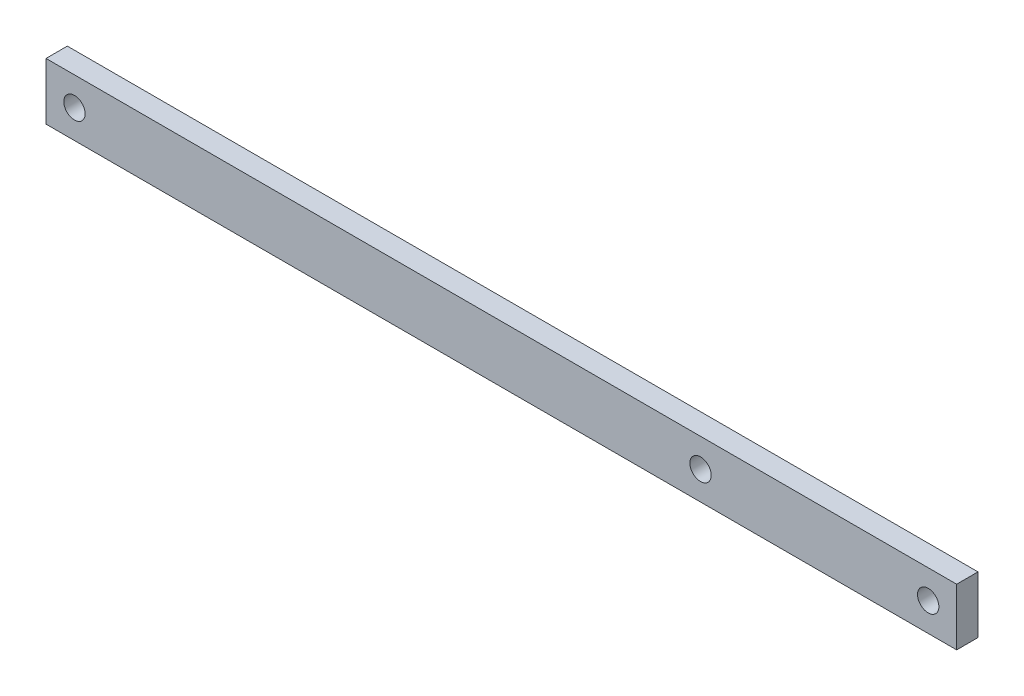
ISO-10303-21;
HEADER;
FILE_DESCRIPTION(('STEP AP214'),'2;1');
FILE_NAME('part.step','',(''),(''),'','','');
FILE_SCHEMA(('AUTOMOTIVE_DESIGN { 1 0 10303 214 1 1 1 1 }'));
ENDSEC;
DATA;
#1=APPLICATION_CONTEXT('core data for automotive mechanical design processes');
#2=APPLICATION_PROTOCOL_DEFINITION('international standard','automotive_design',2000,#1);
#3=PRODUCT_CONTEXT('',#1,'mechanical');
#4=PRODUCT('Part','Part','',(#3));
#5=PRODUCT_RELATED_PRODUCT_CATEGORY('part','',(#4));
#6=PRODUCT_DEFINITION_FORMATION('','',#4);
#7=PRODUCT_DEFINITION_CONTEXT('part definition',#1,'design');
#8=PRODUCT_DEFINITION('design','',#6,#7);
#9=PRODUCT_DEFINITION_SHAPE('','',#8);
#10=(LENGTH_UNIT() NAMED_UNIT(*) SI_UNIT(.MILLI.,.METRE.));
#11=(NAMED_UNIT(*) PLANE_ANGLE_UNIT() SI_UNIT($,.RADIAN.));
#12=(NAMED_UNIT(*) SI_UNIT($,.STERADIAN.) SOLID_ANGLE_UNIT());
#13=UNCERTAINTY_MEASURE_WITH_UNIT(LENGTH_MEASURE(1.E-05),#10,'distance_accuracy_value','');
#14=(GEOMETRIC_REPRESENTATION_CONTEXT(3) GLOBAL_UNCERTAINTY_ASSIGNED_CONTEXT((#13)) GLOBAL_UNIT_ASSIGNED_CONTEXT((#10,
#11,#12)) REPRESENTATION_CONTEXT('',''));
#15=CARTESIAN_POINT('',(0.,0.,0.));
#16=DIRECTION('',(0.,0.,1.));
#17=DIRECTION('',(1.,0.,0.));
#18=AXIS2_PLACEMENT_3D('',#15,#16,#17);
#19=CARTESIAN_POINT('',(0.,0.,4.7625));
#20=DIRECTION('',(0.,0.,1.));
#21=DIRECTION('',(1.,0.,0.));
#22=AXIS2_PLACEMENT_3D('',#19,#20,#21);
#23=PLANE('',#22);
#24=CARTESIAN_POINT('',(44.45,0.,4.7625));
#25=DIRECTION('',(0.,0.,1.));
#26=DIRECTION('',(1.,0.,0.));
#27=AXIS2_PLACEMENT_3D('',#24,#25,#26);
#28=CIRCLE('',#27,2.38125);
#29=CARTESIAN_POINT('',(42.06875,0.,4.7625));
#30=VERTEX_POINT('',#29);
#31=EDGE_CURVE('E115',#30,#30,#28,.T.);
#32=ORIENTED_EDGE('',*,*,#31,.F.);
#33=EDGE_LOOP('',(#32));
#34=FACE_BOUND('',#33,.T.);
#35=DIRECTION('',(0.,-1.,0.));
#36=VECTOR('',#35,1.);
#37=CARTESIAN_POINT('',(-101.6,-6.35000000000001,4.7625));
#38=LINE('',#37,#36);
#39=CARTESIAN_POINT('',(-101.6,6.34999999999999,4.7625));
#40=VERTEX_POINT('',#39);
#41=CARTESIAN_POINT('',(-101.6,-6.35000000000001,4.7625));
#42=VERTEX_POINT('',#41);
#43=EDGE_CURVE('E85',#40,#42,#38,.T.);
#44=ORIENTED_EDGE('',*,*,#43,.T.);
#45=DIRECTION('',(1.,0.,0.));
#46=VECTOR('',#45,1.);
#47=CARTESIAN_POINT('',(101.6,-6.34999999999999,4.7625));
#48=LINE('',#47,#46);
#49=CARTESIAN_POINT('',(101.6,-6.34999999999999,4.7625));
#50=VERTEX_POINT('',#49);
#51=EDGE_CURVE('E80',#42,#50,#48,.T.);
#52=ORIENTED_EDGE('',*,*,#51,.T.);
#53=DIRECTION('',(0.,1.,0.));
#54=VECTOR('',#53,1.);
#55=CARTESIAN_POINT('',(101.6,-6.34999999999999,4.7625));
#56=LINE('',#55,#54);
#57=CARTESIAN_POINT('',(101.6,6.35000000000001,4.7625));
#58=VERTEX_POINT('',#57);
#59=EDGE_CURVE('E83',#50,#58,#56,.T.);
#60=ORIENTED_EDGE('',*,*,#59,.T.);
#61=DIRECTION('',(-1.,0.,0.));
#62=VECTOR('',#61,1.);
#63=CARTESIAN_POINT('',(101.6,6.35000000000001,4.7625));
#64=LINE('',#63,#62);
#65=EDGE_CURVE('E50',#58,#40,#64,.T.);
#66=ORIENTED_EDGE('',*,*,#65,.T.);
#67=EDGE_LOOP('',(#44,#52,#60,#66));
#68=FACE_BOUND('',#67,.T.);
#69=CARTESIAN_POINT('',(95.25,0.,4.7625));
#70=DIRECTION('',(0.,0.,1.));
#71=DIRECTION('',(1.,0.,0.));
#72=AXIS2_PLACEMENT_3D('',#69,#70,#71);
#73=CIRCLE('',#72,2.38125000000001);
#74=CARTESIAN_POINT('',(92.86875,0.,4.7625));
#75=VERTEX_POINT('',#74);
#76=EDGE_CURVE('E100',#75,#75,#73,.T.);
#77=ORIENTED_EDGE('',*,*,#76,.F.);
#78=EDGE_LOOP('',(#77));
#79=FACE_BOUND('',#78,.T.);
#80=CARTESIAN_POINT('',(-95.25,0.,4.7625));
#81=DIRECTION('',(0.,0.,1.));
#82=DIRECTION('',(1.,0.,0.));
#83=AXIS2_PLACEMENT_3D('',#80,#81,#82);
#84=CIRCLE('',#83,2.38125000000001);
#85=CARTESIAN_POINT('',(-97.63125,0.,4.7625));
#86=VERTEX_POINT('',#85);
#87=EDGE_CURVE('E121',#86,#86,#84,.T.);
#88=ORIENTED_EDGE('',*,*,#87,.F.);
#89=EDGE_LOOP('',(#88));
#90=FACE_BOUND('',#89,.T.);
#91=ADVANCED_FACE('F33',(#34,#68,#79,#90),#23,.T.);
#92=CARTESIAN_POINT('',(0.,0.,0.));
#93=DIRECTION('',(0.,0.,1.));
#94=DIRECTION('',(1.,0.,0.));
#95=AXIS2_PLACEMENT_3D('',#92,#93,#94);
#96=PLANE('',#95);
#97=DIRECTION('',(0.,-1.,0.));
#98=VECTOR('',#97,1.);
#99=CARTESIAN_POINT('',(-101.6,-6.35000000000001,0.));
#100=LINE('',#99,#98);
#101=CARTESIAN_POINT('',(-101.6,6.34999999999999,0.));
#102=VERTEX_POINT('',#101);
#103=CARTESIAN_POINT('',(-101.6,-6.35000000000001,0.));
#104=VERTEX_POINT('',#103);
#105=EDGE_CURVE('E97',#102,#104,#100,.T.);
#106=ORIENTED_EDGE('',*,*,#105,.F.);
#107=DIRECTION('',(-1.,0.,0.));
#108=VECTOR('',#107,1.);
#109=CARTESIAN_POINT('',(101.6,6.35000000000001,0.));
#110=LINE('',#109,#108);
#111=CARTESIAN_POINT('',(101.6,6.35000000000001,0.));
#112=VERTEX_POINT('',#111);
#113=EDGE_CURVE('E73',#112,#102,#110,.T.);
#114=ORIENTED_EDGE('',*,*,#113,.F.);
#115=DIRECTION('',(0.,1.,0.));
#116=VECTOR('',#115,1.);
#117=CARTESIAN_POINT('',(101.6,-6.34999999999999,0.));
#118=LINE('',#117,#116);
#119=CARTESIAN_POINT('',(101.6,-6.34999999999999,0.));
#120=VERTEX_POINT('',#119);
#121=EDGE_CURVE('E67',#120,#112,#118,.T.);
#122=ORIENTED_EDGE('',*,*,#121,.F.);
#123=DIRECTION('',(1.,0.,0.));
#124=VECTOR('',#123,1.);
#125=CARTESIAN_POINT('',(101.6,-6.34999999999999,0.));
#126=LINE('',#125,#124);
#127=EDGE_CURVE('E89',#104,#120,#126,.T.);
#128=ORIENTED_EDGE('',*,*,#127,.F.);
#129=EDGE_LOOP('',(#106,#114,#122,#128));
#130=FACE_BOUND('',#129,.T.);
#131=CARTESIAN_POINT('',(95.25,0.,0.));
#132=DIRECTION('',(0.,0.,1.));
#133=DIRECTION('',(1.,0.,0.));
#134=AXIS2_PLACEMENT_3D('',#131,#132,#133);
#135=CIRCLE('',#134,2.38125000000001);
#136=CARTESIAN_POINT('',(92.86875,0.,0.));
#137=VERTEX_POINT('',#136);
#138=EDGE_CURVE('E112',#137,#137,#135,.T.);
#139=ORIENTED_EDGE('',*,*,#138,.T.);
#140=EDGE_LOOP('',(#139));
#141=FACE_BOUND('',#140,.T.);
#142=CARTESIAN_POINT('',(44.45,0.,0.));
#143=DIRECTION('',(0.,0.,1.));
#144=DIRECTION('',(1.,0.,0.));
#145=AXIS2_PLACEMENT_3D('',#142,#143,#144);
#146=CIRCLE('',#145,2.38125);
#147=CARTESIAN_POINT('',(42.06875,0.,0.));
#148=VERTEX_POINT('',#147);
#149=EDGE_CURVE('E118',#148,#148,#146,.T.);
#150=ORIENTED_EDGE('',*,*,#149,.T.);
#151=EDGE_LOOP('',(#150));
#152=FACE_BOUND('',#151,.T.);
#153=CARTESIAN_POINT('',(-95.25,0.,0.));
#154=DIRECTION('',(0.,0.,1.));
#155=DIRECTION('',(1.,0.,0.));
#156=AXIS2_PLACEMENT_3D('',#153,#154,#155);
#157=CIRCLE('',#156,2.38125000000001);
#158=CARTESIAN_POINT('',(-97.63125,0.,0.));
#159=VERTEX_POINT('',#158);
#160=EDGE_CURVE('E124',#159,#159,#157,.T.);
#161=ORIENTED_EDGE('',*,*,#160,.T.);
#162=EDGE_LOOP('',(#161));
#163=FACE_BOUND('',#162,.T.);
#164=ADVANCED_FACE('F108',(#130,#141,#152,#163),#96,.F.);
#165=CARTESIAN_POINT('',(-101.6,-6.35000000000001,4.7625));
#166=DIRECTION('',(1.,0.,0.));
#167=DIRECTION('',(0.,0.,-1.));
#168=AXIS2_PLACEMENT_3D('',#165,#166,#167);
#169=PLANE('',#168);
#170=ORIENTED_EDGE('',*,*,#105,.T.);
#171=DIRECTION('',(0.,0.,-1.));
#172=VECTOR('',#171,1.);
#173=CARTESIAN_POINT('',(-101.6,-6.35000000000001,4.7625));
#174=LINE('',#173,#172);
#175=EDGE_CURVE('E11',#42,#104,#174,.T.);
#176=ORIENTED_EDGE('',*,*,#175,.F.);
#177=ORIENTED_EDGE('',*,*,#43,.F.);
#178=DIRECTION('',(0.,0.,-1.));
#179=VECTOR('',#178,1.);
#180=CARTESIAN_POINT('',(-101.6,6.34999999999999,4.7625));
#181=LINE('',#180,#179);
#182=EDGE_CURVE('E93',#40,#102,#181,.T.);
#183=ORIENTED_EDGE('',*,*,#182,.T.);
#184=EDGE_LOOP('',(#170,#176,#177,#183));
#185=FACE_BOUND('',#184,.T.);
#186=ADVANCED_FACE('F35',(#185),#169,.F.);
#187=CARTESIAN_POINT('',(101.6,-6.34999999999999,4.7625));
#188=DIRECTION('',(0.,1.,0.));
#189=DIRECTION('',(-1.,0.,0.));
#190=AXIS2_PLACEMENT_3D('',#187,#188,#189);
#191=PLANE('',#190);
#192=ORIENTED_EDGE('',*,*,#127,.T.);
#193=DIRECTION('',(0.,0.,-1.));
#194=VECTOR('',#193,1.);
#195=CARTESIAN_POINT('',(101.6,-6.34999999999999,4.7625));
#196=LINE('',#195,#194);
#197=EDGE_CURVE('E42',#50,#120,#196,.T.);
#198=ORIENTED_EDGE('',*,*,#197,.F.);
#199=ORIENTED_EDGE('',*,*,#51,.F.);
#200=ORIENTED_EDGE('',*,*,#175,.T.);
#201=EDGE_LOOP('',(#192,#198,#199,#200));
#202=FACE_BOUND('',#201,.T.);
#203=ADVANCED_FACE('F88',(#202),#191,.F.);
#204=CARTESIAN_POINT('',(101.6,-6.34999999999999,4.7625));
#205=DIRECTION('',(-1.,0.,0.));
#206=DIRECTION('',(0.,0.,1.));
#207=AXIS2_PLACEMENT_3D('',#204,#205,#206);
#208=PLANE('',#207);
#209=ORIENTED_EDGE('',*,*,#121,.T.);
#210=DIRECTION('',(0.,0.,-1.));
#211=VECTOR('',#210,1.);
#212=CARTESIAN_POINT('',(101.6,6.35000000000001,4.7625));
#213=LINE('',#212,#211);
#214=EDGE_CURVE('E90',#58,#112,#213,.T.);
#215=ORIENTED_EDGE('',*,*,#214,.F.);
#216=ORIENTED_EDGE('',*,*,#59,.F.);
#217=ORIENTED_EDGE('',*,*,#197,.T.);
#218=EDGE_LOOP('',(#209,#215,#216,#217));
#219=FACE_BOUND('',#218,.T.);
#220=ADVANCED_FACE('F91',(#219),#208,.F.);
#221=CARTESIAN_POINT('',(101.6,6.35000000000001,4.7625));
#222=DIRECTION('',(0.,-1.,0.));
#223=DIRECTION('',(1.,0.,0.));
#224=AXIS2_PLACEMENT_3D('',#221,#222,#223);
#225=PLANE('',#224);
#226=ORIENTED_EDGE('',*,*,#113,.T.);
#227=ORIENTED_EDGE('',*,*,#182,.F.);
#228=ORIENTED_EDGE('',*,*,#65,.F.);
#229=ORIENTED_EDGE('',*,*,#214,.T.);
#230=EDGE_LOOP('',(#226,#227,#228,#229));
#231=FACE_BOUND('',#230,.T.);
#232=ADVANCED_FACE('F105',(#231),#225,.F.);
#233=CARTESIAN_POINT('',(95.25,0.,4.7625));
#234=DIRECTION('',(0.,0.,-1.));
#235=DIRECTION('',(-1.,0.,0.));
#236=AXIS2_PLACEMENT_3D('',#233,#234,#235);
#237=CYLINDRICAL_SURFACE('',#236,2.38125000000001);
#238=CARTESIAN_POINT('',(92.86875,0.,4.7625));
#239=CARTESIAN_POINT('',(92.86875,0.,4.712890625));
#240=CARTESIAN_POINT('',(92.86875,0.,4.66328125));
#241=CARTESIAN_POINT('',(92.86875,0.,4.5640625));
#242=CARTESIAN_POINT('',(92.86875,0.,4.514453125));
#243=CARTESIAN_POINT('',(92.86875,0.,4.415234375));
#244=CARTESIAN_POINT('',(92.86875,0.,4.365625));
#245=CARTESIAN_POINT('',(92.86875,0.,4.26640625));
#246=CARTESIAN_POINT('',(92.86875,0.,4.216796875));
#247=CARTESIAN_POINT('',(92.86875,0.,4.117578125));
#248=CARTESIAN_POINT('',(92.86875,0.,4.06796875));
#249=CARTESIAN_POINT('',(92.86875,0.,3.96875));
#250=CARTESIAN_POINT('',(92.86875,0.,3.919140625));
#251=CARTESIAN_POINT('',(92.86875,0.,3.819921875));
#252=CARTESIAN_POINT('',(92.86875,0.,3.7703125));
#253=CARTESIAN_POINT('',(92.86875,0.,3.67109375));
#254=CARTESIAN_POINT('',(92.86875,0.,3.621484375));
#255=CARTESIAN_POINT('',(92.86875,0.,3.522265625));
#256=CARTESIAN_POINT('',(92.86875,0.,3.47265625));
#257=CARTESIAN_POINT('',(92.86875,0.,3.3734375));
#258=CARTESIAN_POINT('',(92.86875,0.,3.323828125));
#259=CARTESIAN_POINT('',(92.86875,0.,3.224609375));
#260=CARTESIAN_POINT('',(92.86875,0.,3.175));
#261=CARTESIAN_POINT('',(92.86875,0.,3.07578125));
#262=CARTESIAN_POINT('',(92.86875,0.,3.026171875));
#263=CARTESIAN_POINT('',(92.86875,0.,2.926953125));
#264=CARTESIAN_POINT('',(92.86875,0.,2.87734375));
#265=CARTESIAN_POINT('',(92.86875,0.,2.778125));
#266=CARTESIAN_POINT('',(92.86875,0.,2.728515625));
#267=CARTESIAN_POINT('',(92.86875,0.,2.629296875));
#268=CARTESIAN_POINT('',(92.86875,0.,2.5796875));
#269=CARTESIAN_POINT('',(92.86875,0.,2.48046875));
#270=CARTESIAN_POINT('',(92.86875,0.,2.430859375));
#271=CARTESIAN_POINT('',(92.86875,0.,2.331640625));
#272=CARTESIAN_POINT('',(92.86875,0.,2.28203125));
#273=CARTESIAN_POINT('',(92.86875,0.,2.1828125));
#274=CARTESIAN_POINT('',(92.86875,0.,2.133203125));
#275=CARTESIAN_POINT('',(92.86875,0.,2.033984375));
#276=CARTESIAN_POINT('',(92.86875,0.,1.984375));
#277=CARTESIAN_POINT('',(92.86875,0.,1.88515625));
#278=CARTESIAN_POINT('',(92.86875,0.,1.835546875));
#279=CARTESIAN_POINT('',(92.86875,0.,1.736328125));
#280=CARTESIAN_POINT('',(92.86875,0.,1.68671875));
#281=CARTESIAN_POINT('',(92.86875,0.,1.5875));
#282=CARTESIAN_POINT('',(92.86875,0.,1.537890625));
#283=CARTESIAN_POINT('',(92.86875,0.,1.438671875));
#284=CARTESIAN_POINT('',(92.86875,0.,1.3890625));
#285=CARTESIAN_POINT('',(92.86875,0.,1.28984375));
#286=CARTESIAN_POINT('',(92.86875,0.,1.240234375));
#287=CARTESIAN_POINT('',(92.86875,0.,1.141015625));
#288=CARTESIAN_POINT('',(92.86875,0.,1.09140625));
#289=CARTESIAN_POINT('',(92.86875,0.,0.992187499999999));
#290=CARTESIAN_POINT('',(92.86875,0.,0.942578124999999));
#291=CARTESIAN_POINT('',(92.86875,0.,0.843359375));
#292=CARTESIAN_POINT('',(92.86875,0.,0.79375));
#293=CARTESIAN_POINT('',(92.86875,0.,0.69453125));
#294=CARTESIAN_POINT('',(92.86875,0.,0.644921875));
#295=CARTESIAN_POINT('',(92.86875,0.,0.545703125));
#296=CARTESIAN_POINT('',(92.86875,0.,0.49609375));
#297=CARTESIAN_POINT('',(92.86875,0.,0.396875));
#298=CARTESIAN_POINT('',(92.86875,0.,0.347265625));
#299=CARTESIAN_POINT('',(92.86875,0.,0.248046875));
#300=CARTESIAN_POINT('',(92.86875,0.,0.1984375));
#301=CARTESIAN_POINT('',(92.86875,0.,0.09921875));
#302=CARTESIAN_POINT('',(92.86875,0.,0.049609375));
#303=CARTESIAN_POINT('',(92.86875,0.,0.));
#304=B_SPLINE_CURVE_WITH_KNOTS('',3,(#238,#239,#240,#241,#242,#243,#244,#245,#246,#247,#248,
#249,#250,#251,#252,#253,#254,#255,#256,#257,#258,#259,#260,#261,#262,#263,#264,#265,#266,#267,
#268,#269,#270,#271,#272,#273,#274,#275,#276,#277,#278,#279,#280,#281,#282,#283,#284,#285,#286,
#287,#288,#289,#290,#291,#292,#293,#294,#295,#296,#297,#298,#299,#300,#301,#302,#303),
.UNSPECIFIED.,.F.,.F.,(4,2,2,2,2,2,2,2,2,2,2,2,2,2,2,2,2,2,2,2,2,2,2,2,2,2,2,2,2,2,2,2,4),(0.,
0.148828125,0.29765625,0.446484375,0.5953125,0.744140625,0.892968750000001,1.041796875,1.190625,
1.339453125,1.48828125,1.637109375,1.7859375,1.934765625,2.08359375,2.232421875,2.38125,
2.530078125,2.67890625,2.827734375,2.9765625,3.125390625,3.27421875,3.423046875,3.571875,
3.720703125,3.86953125,4.018359375,4.1671875,4.316015625,4.46484375,4.613671875,4.7625),.UNSPECIFIED.);
#305=EDGE_CURVE('BSEAM142',#75,#137,#304,.T.);
#306=ORIENTED_EDGE('',*,*,#76,.T.);
#307=ORIENTED_EDGE('',*,*,#138,.F.);
#308=ORIENTED_EDGE('',*,*,#305,.T.);
#309=ORIENTED_EDGE('',*,*,#305,.F.);
#310=EDGE_LOOP('',(#306,#308,#307,#309));
#311=FACE_BOUND('',#310,.T.);
#312=ADVANCED_FACE('F142',(#311),#237,.F.);
#313=CARTESIAN_POINT('',(44.45,0.,4.7625));
#314=DIRECTION('',(0.,0.,-1.));
#315=DIRECTION('',(-1.,0.,0.));
#316=AXIS2_PLACEMENT_3D('',#313,#314,#315);
#317=CYLINDRICAL_SURFACE('',#316,2.38125);
#318=CARTESIAN_POINT('',(42.06875,0.,4.7625));
#319=CARTESIAN_POINT('',(42.06875,0.,4.712890625));
#320=CARTESIAN_POINT('',(42.06875,0.,4.66328125));
#321=CARTESIAN_POINT('',(42.06875,0.,4.5640625));
#322=CARTESIAN_POINT('',(42.06875,0.,4.514453125));
#323=CARTESIAN_POINT('',(42.06875,0.,4.415234375));
#324=CARTESIAN_POINT('',(42.06875,0.,4.365625));
#325=CARTESIAN_POINT('',(42.06875,0.,4.26640625));
#326=CARTESIAN_POINT('',(42.06875,0.,4.216796875));
#327=CARTESIAN_POINT('',(42.06875,0.,4.117578125));
#328=CARTESIAN_POINT('',(42.06875,0.,4.06796875));
#329=CARTESIAN_POINT('',(42.06875,0.,3.96875));
#330=CARTESIAN_POINT('',(42.06875,0.,3.919140625));
#331=CARTESIAN_POINT('',(42.06875,0.,3.819921875));
#332=CARTESIAN_POINT('',(42.06875,0.,3.7703125));
#333=CARTESIAN_POINT('',(42.06875,0.,3.67109375));
#334=CARTESIAN_POINT('',(42.06875,0.,3.621484375));
#335=CARTESIAN_POINT('',(42.06875,0.,3.522265625));
#336=CARTESIAN_POINT('',(42.06875,0.,3.47265625));
#337=CARTESIAN_POINT('',(42.06875,0.,3.3734375));
#338=CARTESIAN_POINT('',(42.06875,0.,3.323828125));
#339=CARTESIAN_POINT('',(42.06875,0.,3.224609375));
#340=CARTESIAN_POINT('',(42.06875,0.,3.175));
#341=CARTESIAN_POINT('',(42.06875,0.,3.07578125));
#342=CARTESIAN_POINT('',(42.06875,0.,3.026171875));
#343=CARTESIAN_POINT('',(42.06875,0.,2.926953125));
#344=CARTESIAN_POINT('',(42.06875,0.,2.87734375));
#345=CARTESIAN_POINT('',(42.06875,0.,2.778125));
#346=CARTESIAN_POINT('',(42.06875,0.,2.728515625));
#347=CARTESIAN_POINT('',(42.06875,0.,2.629296875));
#348=CARTESIAN_POINT('',(42.06875,0.,2.5796875));
#349=CARTESIAN_POINT('',(42.06875,0.,2.48046875));
#350=CARTESIAN_POINT('',(42.06875,0.,2.430859375));
#351=CARTESIAN_POINT('',(42.06875,0.,2.331640625));
#352=CARTESIAN_POINT('',(42.06875,0.,2.28203125));
#353=CARTESIAN_POINT('',(42.06875,0.,2.1828125));
#354=CARTESIAN_POINT('',(42.06875,0.,2.133203125));
#355=CARTESIAN_POINT('',(42.06875,0.,2.033984375));
#356=CARTESIAN_POINT('',(42.06875,0.,1.984375));
#357=CARTESIAN_POINT('',(42.06875,0.,1.88515625));
#358=CARTESIAN_POINT('',(42.06875,0.,1.835546875));
#359=CARTESIAN_POINT('',(42.06875,0.,1.736328125));
#360=CARTESIAN_POINT('',(42.06875,0.,1.68671875));
#361=CARTESIAN_POINT('',(42.06875,0.,1.5875));
#362=CARTESIAN_POINT('',(42.06875,0.,1.537890625));
#363=CARTESIAN_POINT('',(42.06875,0.,1.438671875));
#364=CARTESIAN_POINT('',(42.06875,0.,1.3890625));
#365=CARTESIAN_POINT('',(42.06875,0.,1.28984375));
#366=CARTESIAN_POINT('',(42.06875,0.,1.240234375));
#367=CARTESIAN_POINT('',(42.06875,0.,1.141015625));
#368=CARTESIAN_POINT('',(42.06875,0.,1.09140625));
#369=CARTESIAN_POINT('',(42.06875,0.,0.992187499999999));
#370=CARTESIAN_POINT('',(42.06875,0.,0.942578124999999));
#371=CARTESIAN_POINT('',(42.06875,0.,0.843359375));
#372=CARTESIAN_POINT('',(42.06875,0.,0.79375));
#373=CARTESIAN_POINT('',(42.06875,0.,0.69453125));
#374=CARTESIAN_POINT('',(42.06875,0.,0.644921875));
#375=CARTESIAN_POINT('',(42.06875,0.,0.545703125));
#376=CARTESIAN_POINT('',(42.06875,0.,0.49609375));
#377=CARTESIAN_POINT('',(42.06875,0.,0.396875));
#378=CARTESIAN_POINT('',(42.06875,0.,0.347265625));
#379=CARTESIAN_POINT('',(42.06875,0.,0.248046875));
#380=CARTESIAN_POINT('',(42.06875,0.,0.1984375));
#381=CARTESIAN_POINT('',(42.06875,0.,0.09921875));
#382=CARTESIAN_POINT('',(42.06875,0.,0.049609375));
#383=CARTESIAN_POINT('',(42.06875,0.,0.));
#384=B_SPLINE_CURVE_WITH_KNOTS('',3,(#318,#319,#320,#321,#322,#323,#324,#325,#326,#327,#328,
#329,#330,#331,#332,#333,#334,#335,#336,#337,#338,#339,#340,#341,#342,#343,#344,#345,#346,#347,
#348,#349,#350,#351,#352,#353,#354,#355,#356,#357,#358,#359,#360,#361,#362,#363,#364,#365,#366,
#367,#368,#369,#370,#371,#372,#373,#374,#375,#376,#377,#378,#379,#380,#381,#382,#383),
.UNSPECIFIED.,.F.,.F.,(4,2,2,2,2,2,2,2,2,2,2,2,2,2,2,2,2,2,2,2,2,2,2,2,2,2,2,2,2,2,2,2,4),(0.,
0.148828125,0.29765625,0.446484375,0.5953125,0.744140625,0.892968750000001,1.041796875,1.190625,
1.339453125,1.48828125,1.637109375,1.7859375,1.934765625,2.08359375,2.232421875,2.38125,
2.530078125,2.67890625,2.827734375,2.9765625,3.125390625,3.27421875,3.423046875,3.571875,
3.720703125,3.86953125,4.018359375,4.1671875,4.316015625,4.46484375,4.613671875,4.7625),.UNSPECIFIED.);
#385=EDGE_CURVE('BSEAM188',#30,#148,#384,.T.);
#386=ORIENTED_EDGE('',*,*,#31,.T.);
#387=ORIENTED_EDGE('',*,*,#149,.F.);
#388=ORIENTED_EDGE('',*,*,#385,.T.);
#389=ORIENTED_EDGE('',*,*,#385,.F.);
#390=EDGE_LOOP('',(#386,#388,#387,#389));
#391=FACE_BOUND('',#390,.T.);
#392=ADVANCED_FACE('F188',(#391),#317,.F.);
#393=CARTESIAN_POINT('',(-95.25,0.,4.7625));
#394=DIRECTION('',(0.,0.,-1.));
#395=DIRECTION('',(-1.,0.,0.));
#396=AXIS2_PLACEMENT_3D('',#393,#394,#395);
#397=CYLINDRICAL_SURFACE('',#396,2.38125000000001);
#398=CARTESIAN_POINT('',(-97.63125,0.,4.7625));
#399=CARTESIAN_POINT('',(-97.63125,0.,4.712890625));
#400=CARTESIAN_POINT('',(-97.63125,0.,4.66328125));
#401=CARTESIAN_POINT('',(-97.63125,0.,4.5640625));
#402=CARTESIAN_POINT('',(-97.63125,0.,4.514453125));
#403=CARTESIAN_POINT('',(-97.63125,0.,4.415234375));
#404=CARTESIAN_POINT('',(-97.63125,0.,4.365625));
#405=CARTESIAN_POINT('',(-97.63125,0.,4.26640625));
#406=CARTESIAN_POINT('',(-97.63125,0.,4.216796875));
#407=CARTESIAN_POINT('',(-97.63125,0.,4.117578125));
#408=CARTESIAN_POINT('',(-97.63125,0.,4.06796875));
#409=CARTESIAN_POINT('',(-97.63125,0.,3.96875));
#410=CARTESIAN_POINT('',(-97.63125,0.,3.919140625));
#411=CARTESIAN_POINT('',(-97.63125,0.,3.819921875));
#412=CARTESIAN_POINT('',(-97.63125,0.,3.7703125));
#413=CARTESIAN_POINT('',(-97.63125,0.,3.67109375));
#414=CARTESIAN_POINT('',(-97.63125,0.,3.621484375));
#415=CARTESIAN_POINT('',(-97.63125,0.,3.522265625));
#416=CARTESIAN_POINT('',(-97.63125,0.,3.47265625));
#417=CARTESIAN_POINT('',(-97.63125,0.,3.3734375));
#418=CARTESIAN_POINT('',(-97.63125,0.,3.323828125));
#419=CARTESIAN_POINT('',(-97.63125,0.,3.224609375));
#420=CARTESIAN_POINT('',(-97.63125,0.,3.175));
#421=CARTESIAN_POINT('',(-97.63125,0.,3.07578125));
#422=CARTESIAN_POINT('',(-97.63125,0.,3.026171875));
#423=CARTESIAN_POINT('',(-97.63125,0.,2.926953125));
#424=CARTESIAN_POINT('',(-97.63125,0.,2.87734375));
#425=CARTESIAN_POINT('',(-97.63125,0.,2.778125));
#426=CARTESIAN_POINT('',(-97.63125,0.,2.728515625));
#427=CARTESIAN_POINT('',(-97.63125,0.,2.629296875));
#428=CARTESIAN_POINT('',(-97.63125,0.,2.5796875));
#429=CARTESIAN_POINT('',(-97.63125,0.,2.48046875));
#430=CARTESIAN_POINT('',(-97.63125,0.,2.430859375));
#431=CARTESIAN_POINT('',(-97.63125,0.,2.331640625));
#432=CARTESIAN_POINT('',(-97.63125,0.,2.28203125));
#433=CARTESIAN_POINT('',(-97.63125,0.,2.1828125));
#434=CARTESIAN_POINT('',(-97.63125,0.,2.133203125));
#435=CARTESIAN_POINT('',(-97.63125,0.,2.033984375));
#436=CARTESIAN_POINT('',(-97.63125,0.,1.984375));
#437=CARTESIAN_POINT('',(-97.63125,0.,1.88515625));
#438=CARTESIAN_POINT('',(-97.63125,0.,1.835546875));
#439=CARTESIAN_POINT('',(-97.63125,0.,1.736328125));
#440=CARTESIAN_POINT('',(-97.63125,0.,1.68671875));
#441=CARTESIAN_POINT('',(-97.63125,0.,1.5875));
#442=CARTESIAN_POINT('',(-97.63125,0.,1.537890625));
#443=CARTESIAN_POINT('',(-97.63125,0.,1.438671875));
#444=CARTESIAN_POINT('',(-97.63125,0.,1.3890625));
#445=CARTESIAN_POINT('',(-97.63125,0.,1.28984375));
#446=CARTESIAN_POINT('',(-97.63125,0.,1.240234375));
#447=CARTESIAN_POINT('',(-97.63125,0.,1.141015625));
#448=CARTESIAN_POINT('',(-97.63125,0.,1.09140625));
#449=CARTESIAN_POINT('',(-97.63125,0.,0.992187499999999));
#450=CARTESIAN_POINT('',(-97.63125,0.,0.942578124999999));
#451=CARTESIAN_POINT('',(-97.63125,0.,0.843359375));
#452=CARTESIAN_POINT('',(-97.63125,0.,0.79375));
#453=CARTESIAN_POINT('',(-97.63125,0.,0.69453125));
#454=CARTESIAN_POINT('',(-97.63125,0.,0.644921875));
#455=CARTESIAN_POINT('',(-97.63125,0.,0.545703125));
#456=CARTESIAN_POINT('',(-97.63125,0.,0.49609375));
#457=CARTESIAN_POINT('',(-97.63125,0.,0.396875));
#458=CARTESIAN_POINT('',(-97.63125,0.,0.347265625));
#459=CARTESIAN_POINT('',(-97.63125,0.,0.248046875));
#460=CARTESIAN_POINT('',(-97.63125,0.,0.1984375));
#461=CARTESIAN_POINT('',(-97.63125,0.,0.09921875));
#462=CARTESIAN_POINT('',(-97.63125,0.,0.049609375));
#463=CARTESIAN_POINT('',(-97.63125,0.,0.));
#464=B_SPLINE_CURVE_WITH_KNOTS('',3,(#398,#399,#400,#401,#402,#403,#404,#405,#406,#407,#408,
#409,#410,#411,#412,#413,#414,#415,#416,#417,#418,#419,#420,#421,#422,#423,#424,#425,#426,#427,
#428,#429,#430,#431,#432,#433,#434,#435,#436,#437,#438,#439,#440,#441,#442,#443,#444,#445,#446,
#447,#448,#449,#450,#451,#452,#453,#454,#455,#456,#457,#458,#459,#460,#461,#462,#463),
.UNSPECIFIED.,.F.,.F.,(4,2,2,2,2,2,2,2,2,2,2,2,2,2,2,2,2,2,2,2,2,2,2,2,2,2,2,2,2,2,2,2,4),(0.,
0.148828125,0.29765625,0.446484375,0.5953125,0.744140625,0.892968750000001,1.041796875,1.190625,
1.339453125,1.48828125,1.637109375,1.7859375,1.934765625,2.08359375,2.232421875,2.38125,
2.530078125,2.67890625,2.827734375,2.9765625,3.125390625,3.27421875,3.423046875,3.571875,
3.720703125,3.86953125,4.018359375,4.1671875,4.316015625,4.46484375,4.613671875,4.7625),.UNSPECIFIED.);
#465=EDGE_CURVE('BSEAM130',#86,#159,#464,.T.);
#466=ORIENTED_EDGE('',*,*,#87,.T.);
#467=ORIENTED_EDGE('',*,*,#160,.F.);
#468=ORIENTED_EDGE('',*,*,#465,.T.);
#469=ORIENTED_EDGE('',*,*,#465,.F.);
#470=EDGE_LOOP('',(#466,#468,#467,#469));
#471=FACE_BOUND('',#470,.T.);
#472=ADVANCED_FACE('F130',(#471),#397,.F.);
#473=CLOSED_SHELL('',(#91,#164,#186,#203,#220,#232,#312,#392,#472));
#474=MANIFOLD_SOLID_BREP('B2',#473);
#475=ADVANCED_BREP_SHAPE_REPRESENTATION('',(#18,#474),#14);
#476=SHAPE_DEFINITION_REPRESENTATION(#9,#475);
ENDSEC;
END-ISO-10303-21;
